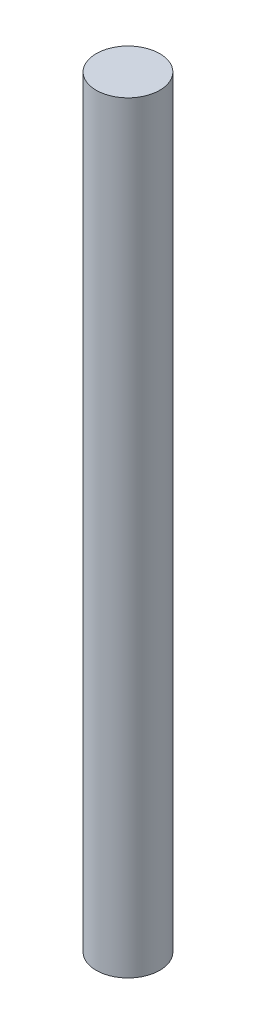
ISO-10303-21;
HEADER;
FILE_DESCRIPTION(('STEP AP214'),'2;1');
FILE_NAME('part.step','',(''),(''),'','','');
FILE_SCHEMA(('AUTOMOTIVE_DESIGN { 1 0 10303 214 1 1 1 1 }'));
ENDSEC;
DATA;
#1=APPLICATION_CONTEXT('core data for automotive mechanical design processes');
#2=APPLICATION_PROTOCOL_DEFINITION('international standard','automotive_design',2000,#1);
#3=PRODUCT_CONTEXT('',#1,'mechanical');
#4=PRODUCT('Part','Part','',(#3));
#5=PRODUCT_RELATED_PRODUCT_CATEGORY('part','',(#4));
#6=PRODUCT_DEFINITION_FORMATION('','',#4);
#7=PRODUCT_DEFINITION_CONTEXT('part definition',#1,'design');
#8=PRODUCT_DEFINITION('design','',#6,#7);
#9=PRODUCT_DEFINITION_SHAPE('','',#8);
#10=(LENGTH_UNIT() NAMED_UNIT(*) SI_UNIT(.MILLI.,.METRE.));
#11=(NAMED_UNIT(*) PLANE_ANGLE_UNIT() SI_UNIT($,.RADIAN.));
#12=(NAMED_UNIT(*) SI_UNIT($,.STERADIAN.) SOLID_ANGLE_UNIT());
#13=UNCERTAINTY_MEASURE_WITH_UNIT(LENGTH_MEASURE(1.E-05),#10,'distance_accuracy_value','');
#14=(GEOMETRIC_REPRESENTATION_CONTEXT(3) GLOBAL_UNCERTAINTY_ASSIGNED_CONTEXT((#13)) GLOBAL_UNIT_ASSIGNED_CONTEXT((#10,
#11,#12)) REPRESENTATION_CONTEXT('',''));
#15=CARTESIAN_POINT('',(0.,0.,0.));
#16=DIRECTION('',(0.,0.,1.));
#17=DIRECTION('',(1.,0.,0.));
#18=AXIS2_PLACEMENT_3D('',#15,#16,#17);
#19=CARTESIAN_POINT('',(0.,120.,0.));
#20=DIRECTION('',(0.,-1.,0.));
#21=DIRECTION('',(0.,0.,-1.));
#22=AXIS2_PLACEMENT_3D('',#19,#20,#21);
#23=CYLINDRICAL_SURFACE('',#22,5.);
#24=CARTESIAN_POINT('',(0.,120.,0.));
#25=DIRECTION('',(0.,1.,0.));
#26=DIRECTION('',(0.,0.,1.));
#27=AXIS2_PLACEMENT_3D('',#24,#25,#26);
#28=CIRCLE('',#27,5.);
#29=CARTESIAN_POINT('',(0.,120.,5.));
#30=VERTEX_POINT('',#29);
#31=EDGE_CURVE('E10',#30,#30,#28,.T.);
#32=ORIENTED_EDGE('',*,*,#31,.F.);
#33=EDGE_LOOP('',(#32));
#34=FACE_BOUND('',#33,.T.);
#35=CARTESIAN_POINT('',(0.,0.,0.));
#36=DIRECTION('',(0.,1.,0.));
#37=DIRECTION('',(0.,0.,1.));
#38=AXIS2_PLACEMENT_3D('',#35,#36,#37);
#39=CIRCLE('',#38,5.);
#40=CARTESIAN_POINT('',(0.,0.,5.));
#41=VERTEX_POINT('',#40);
#42=EDGE_CURVE('E41',#41,#41,#39,.T.);
#43=ORIENTED_EDGE('',*,*,#42,.T.);
#44=EDGE_LOOP('',(#43));
#45=FACE_BOUND('',#44,.T.);
#46=ADVANCED_FACE('F37',(#34,#45),#23,.T.);
#47=CARTESIAN_POINT('',(0.,120.,0.));
#48=DIRECTION('',(0.,1.,0.));
#49=DIRECTION('',(0.,0.,1.));
#50=AXIS2_PLACEMENT_3D('',#47,#48,#49);
#51=PLANE('',#50);
#52=ORIENTED_EDGE('',*,*,#31,.T.);
#53=EDGE_LOOP('',(#52));
#54=FACE_BOUND('',#53,.T.);
#55=ADVANCED_FACE('F67',(#54),#51,.T.);
#56=CARTESIAN_POINT('',(0.,0.,0.));
#57=DIRECTION('',(0.,1.,0.));
#58=DIRECTION('',(-1.,0.,0.));
#59=AXIS2_PLACEMENT_3D('',#56,#57,#58);
#60=PLANE('',#59);
#61=CARTESIAN_POINT('',(0.,0.,0.));
#62=DIRECTION('',(0.,1.,0.));
#63=DIRECTION('',(-1.,0.,0.));
#64=AXIS2_PLACEMENT_3D('',#61,#62,#63);
#65=CIRCLE('',#64,3.35);
#66=CARTESIAN_POINT('',(-3.35,0.,0.));
#67=VERTEX_POINT('',#66);
#68=EDGE_CURVE('E48',#67,#67,#65,.T.);
#69=ORIENTED_EDGE('',*,*,#68,.T.);
#70=EDGE_LOOP('',(#69));
#71=FACE_BOUND('',#70,.T.);
#72=ORIENTED_EDGE('',*,*,#42,.F.);
#73=EDGE_LOOP('',(#72));
#74=FACE_BOUND('',#73,.T.);
#75=ADVANCED_FACE('F39',(#71,#74),#60,.F.);
#76=CARTESIAN_POINT('',(3.35,17.,0.));
#77=DIRECTION('',(0.,-1.,0.));
#78=DIRECTION('',(1.,0.,0.));
#79=AXIS2_PLACEMENT_3D('',#76,#77,#78);
#80=PLANE('',#79);
#81=CARTESIAN_POINT('',(0.,17.,0.));
#82=DIRECTION('',(0.,1.,0.));
#83=DIRECTION('',(-1.,0.,0.));
#84=AXIS2_PLACEMENT_3D('',#81,#82,#83);
#85=CIRCLE('',#84,3.35);
#86=CARTESIAN_POINT('',(-3.35,17.,0.));
#87=VERTEX_POINT('',#86);
#88=EDGE_CURVE('E52',#87,#87,#85,.T.);
#89=ORIENTED_EDGE('',*,*,#88,.F.);
#90=EDGE_LOOP('',(#89));
#91=FACE_BOUND('',#90,.T.);
#92=ADVANCED_FACE('F59',(#91),#80,.T.);
#93=CARTESIAN_POINT('',(0.,17.,0.));
#94=DIRECTION('',(0.,1.,0.));
#95=DIRECTION('',(-1.,0.,0.));
#96=AXIS2_PLACEMENT_3D('',#93,#94,#95);
#97=CYLINDRICAL_SURFACE('',#96,3.35);
#98=ORIENTED_EDGE('',*,*,#88,.T.);
#99=EDGE_LOOP('',(#98));
#100=FACE_BOUND('',#99,.T.);
#101=ORIENTED_EDGE('',*,*,#68,.F.);
#102=EDGE_LOOP('',(#101));
#103=FACE_BOUND('',#102,.T.);
#104=ADVANCED_FACE('F56',(#100,#103),#97,.F.);
#105=CLOSED_SHELL('',(#46,#55,#75,#92,#104));
#106=MANIFOLD_SOLID_BREP('B2',#105);
#107=ADVANCED_BREP_SHAPE_REPRESENTATION('',(#18,#106),#14);
#108=SHAPE_DEFINITION_REPRESENTATION(#9,#107);
ENDSEC;
END-ISO-10303-21;
